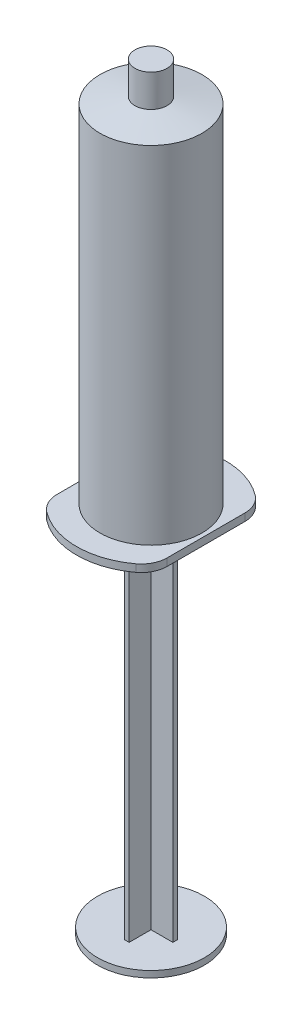
ISO-10303-21;
HEADER;
FILE_DESCRIPTION(('STEP AP214'),'2;1');
FILE_NAME('part.step','',(''),(''),'','','');
FILE_SCHEMA(('AUTOMOTIVE_DESIGN { 1 0 10303 214 1 1 1 1 }'));
ENDSEC;
DATA;
#1=APPLICATION_CONTEXT('core data for automotive mechanical design processes');
#2=APPLICATION_PROTOCOL_DEFINITION('international standard','automotive_design',2000,#1);
#3=PRODUCT_CONTEXT('',#1,'mechanical');
#4=PRODUCT('Part','Part','',(#3));
#5=PRODUCT_RELATED_PRODUCT_CATEGORY('part','',(#4));
#6=PRODUCT_DEFINITION_FORMATION('','',#4);
#7=PRODUCT_DEFINITION_CONTEXT('part definition',#1,'design');
#8=PRODUCT_DEFINITION('design','',#6,#7);
#9=PRODUCT_DEFINITION_SHAPE('','',#8);
#10=(LENGTH_UNIT() NAMED_UNIT(*) SI_UNIT(.MILLI.,.METRE.));
#11=(NAMED_UNIT(*) PLANE_ANGLE_UNIT() SI_UNIT($,.RADIAN.));
#12=(NAMED_UNIT(*) SI_UNIT($,.STERADIAN.) SOLID_ANGLE_UNIT());
#13=UNCERTAINTY_MEASURE_WITH_UNIT(LENGTH_MEASURE(1.E-05),#10,'distance_accuracy_value','');
#14=(GEOMETRIC_REPRESENTATION_CONTEXT(3) GLOBAL_UNCERTAINTY_ASSIGNED_CONTEXT((#13)) GLOBAL_UNIT_ASSIGNED_CONTEXT((#10,
#11,#12)) REPRESENTATION_CONTEXT('',''));
#15=CARTESIAN_POINT('',(0.,0.,0.));
#16=DIRECTION('',(0.,0.,1.));
#17=DIRECTION('',(1.,0.,0.));
#18=AXIS2_PLACEMENT_3D('',#15,#16,#17);
#19=CARTESIAN_POINT('',(-9.,-2.3,-12.));
#20=DIRECTION('',(0.,-1.,0.));
#21=DIRECTION('',(0.,0.,-1.));
#22=AXIS2_PLACEMENT_3D('',#19,#20,#21);
#23=PLANE('',#22);
#24=CARTESIAN_POINT('',(-9.,-2.3,-12.));
#25=DIRECTION('',(0.,-1.,0.));
#26=DIRECTION('',(0.,0.,-1.));
#27=AXIS2_PLACEMENT_3D('',#24,#25,#26);
#28=CIRCLE('',#27,8.);
#29=CARTESIAN_POINT('',(-17.,-2.3,-12.));
#30=VERTEX_POINT('',#29);
#31=CARTESIAN_POINT('',(-13.8,-2.3,-18.4));
#32=VERTEX_POINT('',#31);
#33=EDGE_CURVE('E158',#30,#32,#28,.T.);
#34=ORIENTED_EDGE('',*,*,#33,.T.);
#35=CARTESIAN_POINT('',(0.,-2.3,0.));
#36=DIRECTION('',(0.,-1.,0.));
#37=DIRECTION('',(0.,0.,-1.));
#38=AXIS2_PLACEMENT_3D('',#35,#36,#37);
#39=CIRCLE('',#38,23.);
#40=CARTESIAN_POINT('',(13.8,-2.3,-18.4));
#41=VERTEX_POINT('',#40);
#42=EDGE_CURVE('E98',#32,#41,#39,.T.);
#43=ORIENTED_EDGE('',*,*,#42,.T.);
#44=CARTESIAN_POINT('',(9.,-2.3,-12.));
#45=DIRECTION('',(0.,-1.,0.));
#46=DIRECTION('',(0.,0.,1.));
#47=AXIS2_PLACEMENT_3D('',#44,#45,#46);
#48=CIRCLE('',#47,8.);
#49=CARTESIAN_POINT('',(17.,-2.3,-12.));
#50=VERTEX_POINT('',#49);
#51=EDGE_CURVE('E575',#41,#50,#48,.T.);
#52=ORIENTED_EDGE('',*,*,#51,.T.);
#53=DIRECTION('',(0.,0.,1.));
#54=VECTOR('',#53,1.);
#55=CARTESIAN_POINT('',(17.,-2.3,12.));
#56=LINE('',#55,#54);
#57=CARTESIAN_POINT('',(17.,-2.3,12.));
#58=VERTEX_POINT('',#57);
#59=EDGE_CURVE('E577',#50,#58,#56,.T.);
#60=ORIENTED_EDGE('',*,*,#59,.T.);
#61=CARTESIAN_POINT('',(9.,-2.3,12.));
#62=DIRECTION('',(0.,-1.,0.));
#63=DIRECTION('',(0.,0.,-1.));
#64=AXIS2_PLACEMENT_3D('',#61,#62,#63);
#65=CIRCLE('',#64,8.);
#66=CARTESIAN_POINT('',(13.8,-2.3,18.4));
#67=VERTEX_POINT('',#66);
#68=EDGE_CURVE('E121',#58,#67,#65,.T.);
#69=ORIENTED_EDGE('',*,*,#68,.T.);
#70=CARTESIAN_POINT('',(0.,-2.3,0.));
#71=DIRECTION('',(0.,-1.,0.));
#72=DIRECTION('',(0.,0.,-1.));
#73=AXIS2_PLACEMENT_3D('',#70,#71,#72);
#74=CIRCLE('',#73,23.);
#75=CARTESIAN_POINT('',(-13.8,-2.3,18.4));
#76=VERTEX_POINT('',#75);
#77=EDGE_CURVE('E114',#67,#76,#74,.T.);
#78=ORIENTED_EDGE('',*,*,#77,.T.);
#79=CARTESIAN_POINT('',(-9.,-2.3,12.));
#80=DIRECTION('',(0.,-1.,0.));
#81=DIRECTION('',(0.,0.,1.));
#82=AXIS2_PLACEMENT_3D('',#79,#80,#81);
#83=CIRCLE('',#82,8.);
#84=CARTESIAN_POINT('',(-17.,-2.3,12.));
#85=VERTEX_POINT('',#84);
#86=EDGE_CURVE('E118',#76,#85,#83,.T.);
#87=ORIENTED_EDGE('',*,*,#86,.T.);
#88=DIRECTION('',(0.,0.,-1.));
#89=VECTOR('',#88,1.);
#90=CARTESIAN_POINT('',(-17.,-2.3,12.));
#91=LINE('',#90,#89);
#92=EDGE_CURVE('E56',#85,#30,#91,.T.);
#93=ORIENTED_EDGE('',*,*,#92,.T.);
#94=EDGE_LOOP('',(#34,#43,#52,#60,#69,#78,#87,#93));
#95=FACE_BOUND('',#94,.T.);
#96=DIRECTION('',(-1.,0.,0.));
#97=VECTOR('',#96,1.);
#98=CARTESIAN_POINT('',(-0.750000000000001,-2.3,7.5));
#99=LINE('',#98,#97);
#100=CARTESIAN_POINT('',(0.749999999999999,-2.3,7.5));
#101=VERTEX_POINT('',#100);
#102=CARTESIAN_POINT('',(-0.750000000000001,-2.3,7.5));
#103=VERTEX_POINT('',#102);
#104=EDGE_CURVE('E469',#101,#103,#99,.T.);
#105=ORIENTED_EDGE('',*,*,#104,.F.);
#106=DIRECTION('',(0.,0.,1.));
#107=VECTOR('',#106,1.);
#108=CARTESIAN_POINT('',(0.75,-2.3,0.750000000000002));
#109=LINE('',#108,#107);
#110=CARTESIAN_POINT('',(0.75,-2.3,0.750000000000002));
#111=VERTEX_POINT('',#110);
#112=EDGE_CURVE('E465',#111,#101,#109,.T.);
#113=ORIENTED_EDGE('',*,*,#112,.F.);
#114=DIRECTION('',(-1.,0.,0.));
#115=VECTOR('',#114,1.);
#116=CARTESIAN_POINT('',(0.75,-2.3,0.750000000000002));
#117=LINE('',#116,#115);
#118=CARTESIAN_POINT('',(7.5,-2.3,0.75));
#119=VERTEX_POINT('',#118);
#120=EDGE_CURVE('E478',#119,#111,#117,.T.);
#121=ORIENTED_EDGE('',*,*,#120,.F.);
#122=DIRECTION('',(0.,0.,1.));
#123=VECTOR('',#122,1.);
#124=CARTESIAN_POINT('',(7.5,-2.3,0.75));
#125=LINE('',#124,#123);
#126=CARTESIAN_POINT('',(7.5,-2.3,-0.75));
#127=VERTEX_POINT('',#126);
#128=EDGE_CURVE('E538',#127,#119,#125,.T.);
#129=ORIENTED_EDGE('',*,*,#128,.F.);
#130=DIRECTION('',(1.,0.,0.));
#131=VECTOR('',#130,1.);
#132=CARTESIAN_POINT('',(0.749999999999999,-2.3,-0.749999999999999));
#133=LINE('',#132,#131);
#134=CARTESIAN_POINT('',(0.749999999999999,-2.3,-0.749999999999999));
#135=VERTEX_POINT('',#134);
#136=EDGE_CURVE('E535',#135,#127,#133,.T.);
#137=ORIENTED_EDGE('',*,*,#136,.F.);
#138=DIRECTION('',(0.,0.,1.));
#139=VECTOR('',#138,1.);
#140=CARTESIAN_POINT('',(0.749999999999999,-2.3,-7.5));
#141=LINE('',#140,#139);
#142=CARTESIAN_POINT('',(0.749999999999999,-2.3,-7.5));
#143=VERTEX_POINT('',#142);
#144=EDGE_CURVE('E532',#143,#135,#141,.T.);
#145=ORIENTED_EDGE('',*,*,#144,.F.);
#146=DIRECTION('',(1.,0.,0.));
#147=VECTOR('',#146,1.);
#148=CARTESIAN_POINT('',(-0.750000000000001,-2.3,-7.5));
#149=LINE('',#148,#147);
#150=CARTESIAN_POINT('',(-0.750000000000001,-2.3,-7.5));
#151=VERTEX_POINT('',#150);
#152=EDGE_CURVE('E529',#151,#143,#149,.T.);
#153=ORIENTED_EDGE('',*,*,#152,.F.);
#154=DIRECTION('',(0.,0.,-1.));
#155=VECTOR('',#154,1.);
#156=CARTESIAN_POINT('',(-0.750000000000001,-2.3,-7.5));
#157=LINE('',#156,#155);
#158=CARTESIAN_POINT('',(-0.75,-2.3,-0.750000000000001));
#159=VERTEX_POINT('',#158);
#160=EDGE_CURVE('E526',#159,#151,#157,.T.);
#161=ORIENTED_EDGE('',*,*,#160,.F.);
#162=DIRECTION('',(1.,0.,0.));
#163=VECTOR('',#162,1.);
#164=CARTESIAN_POINT('',(-7.5,-2.3,-0.75));
#165=LINE('',#164,#163);
#166=CARTESIAN_POINT('',(-7.5,-2.3,-0.75));
#167=VERTEX_POINT('',#166);
#168=EDGE_CURVE('E523',#167,#159,#165,.T.);
#169=ORIENTED_EDGE('',*,*,#168,.F.);
#170=DIRECTION('',(0.,0.,-1.));
#171=VECTOR('',#170,1.);
#172=CARTESIAN_POINT('',(-7.5,-2.3,0.75));
#173=LINE('',#172,#171);
#174=CARTESIAN_POINT('',(-7.5,-2.3,0.75));
#175=VERTEX_POINT('',#174);
#176=EDGE_CURVE('E520',#175,#167,#173,.T.);
#177=ORIENTED_EDGE('',*,*,#176,.F.);
#178=DIRECTION('',(-1.,0.,0.));
#179=VECTOR('',#178,1.);
#180=CARTESIAN_POINT('',(-7.5,-2.3,0.75));
#181=LINE('',#180,#179);
#182=CARTESIAN_POINT('',(-0.750000000000001,-2.3,0.75));
#183=VERTEX_POINT('',#182);
#184=EDGE_CURVE('E517',#183,#175,#181,.T.);
#185=ORIENTED_EDGE('',*,*,#184,.F.);
#186=DIRECTION('',(0.,0.,-1.));
#187=VECTOR('',#186,1.);
#188=CARTESIAN_POINT('',(-0.750000000000001,-2.3,0.75));
#189=LINE('',#188,#187);
#190=EDGE_CURVE('E514',#103,#183,#189,.T.);
#191=ORIENTED_EDGE('',*,*,#190,.F.);
#192=EDGE_LOOP('',(#105,#113,#121,#129,#137,#145,#153,#161,#169,#177,#185,#191));
#193=FACE_BOUND('',#192,.T.);
#194=ADVANCED_FACE('F32',(#95,#193),#23,.T.);
#195=CARTESIAN_POINT('',(0.,109.,0.));
#196=DIRECTION('',(0.,-1.,0.));
#197=DIRECTION('',(0.,0.,-1.));
#198=AXIS2_PLACEMENT_3D('',#195,#196,#197);
#199=CYLINDRICAL_SURFACE('',#198,15.75);
#200=CARTESIAN_POINT('',(0.,107.,0.));
#201=DIRECTION('',(0.,1.,0.));
#202=DIRECTION('',(0.,0.,1.));
#203=AXIS2_PLACEMENT_3D('',#200,#201,#202);
#204=CIRCLE('',#203,15.75);
#205=CARTESIAN_POINT('',(0.,107.,-15.75));
#206=VERTEX_POINT('',#205);
#207=EDGE_CURVE('E11',#206,#206,#204,.F.);
#208=ORIENTED_EDGE('',*,*,#207,.T.);
#209=EDGE_LOOP('',(#208));
#210=FACE_BOUND('',#209,.T.);
#211=CARTESIAN_POINT('',(0.,0.,0.));
#212=DIRECTION('',(0.,-1.,0.));
#213=DIRECTION('',(0.,0.,-1.));
#214=AXIS2_PLACEMENT_3D('',#211,#212,#213);
#215=CIRCLE('',#214,15.75);
#216=CARTESIAN_POINT('',(0.,0.,-15.75));
#217=VERTEX_POINT('',#216);
#218=EDGE_CURVE('E173',#217,#217,#215,.T.);
#219=ORIENTED_EDGE('',*,*,#218,.F.);
#220=EDGE_LOOP('',(#219));
#221=FACE_BOUND('',#220,.T.);
#222=ADVANCED_FACE('F184',(#210,#221),#199,.T.);
#223=CARTESIAN_POINT('',(0.,109.,0.));
#224=DIRECTION('',(0.,-1.,0.));
#225=DIRECTION('',(0.,0.,-1.));
#226=AXIS2_PLACEMENT_3D('',#223,#224,#225);
#227=CONICAL_SURFACE('',#226,4.95896565136172,1.38753675533549);
#228=CARTESIAN_POINT('',(0.,109.,0.));
#229=DIRECTION('',(0.,1.,0.));
#230=DIRECTION('',(0.,0.,1.));
#231=AXIS2_PLACEMENT_3D('',#228,#229,#230);
#232=CIRCLE('',#231,4.95896565136172);
#233=CARTESIAN_POINT('',(0.,109.,-4.95896565136176));
#234=VERTEX_POINT('',#233);
#235=EDGE_CURVE('E40',#234,#234,#232,.T.);
#236=CARTESIAN_POINT('',(0.,107.,-15.75));
#237=CARTESIAN_POINT('',(0.,107.020833333333,-15.6375933922017));
#238=CARTESIAN_POINT('',(0.,107.041666666667,-15.5251867844034));
#239=CARTESIAN_POINT('',(0.,107.083333333333,-15.3003735688068));
#240=CARTESIAN_POINT('',(0.,107.104166666667,-15.1879669610085));
#241=CARTESIAN_POINT('',(0.,107.145833333333,-14.9631537454118));
#242=CARTESIAN_POINT('',(0.,107.166666666667,-14.8507471376135));
#243=CARTESIAN_POINT('',(0.,107.208333333333,-14.6259339220169));
#244=CARTESIAN_POINT('',(0.,107.229166666667,-14.5135273142186));
#245=CARTESIAN_POINT('',(0.,107.270833333333,-14.2887140986219));
#246=CARTESIAN_POINT('',(0.,107.291666666667,-14.1763074908236));
#247=CARTESIAN_POINT('',(0.,107.333333333333,-13.951494275227));
#248=CARTESIAN_POINT('',(0.,107.354166666667,-13.8390876674287));
#249=CARTESIAN_POINT('',(0.,107.395833333333,-13.614274451832));
#250=CARTESIAN_POINT('',(0.,107.416666666667,-13.5018678440337));
#251=CARTESIAN_POINT('',(0.,107.458333333333,-13.2770546284371));
#252=CARTESIAN_POINT('',(0.,107.479166666667,-13.1646480206388));
#253=CARTESIAN_POINT('',(0.,107.520833333333,-12.9398348050422));
#254=CARTESIAN_POINT('',(0.,107.541666666667,-12.8274281972438));
#255=CARTESIAN_POINT('',(0.,107.583333333333,-12.6026149816472));
#256=CARTESIAN_POINT('',(0.,107.604166666667,-12.4902083738489));
#257=CARTESIAN_POINT('',(0.,107.645833333333,-12.2653951582523));
#258=CARTESIAN_POINT('',(0.,107.666666666667,-12.1529885504539));
#259=CARTESIAN_POINT('',(0.,107.708333333333,-11.9281753348573));
#260=CARTESIAN_POINT('',(0.,107.729166666667,-11.815768727059));
#261=CARTESIAN_POINT('',(0.,107.770833333333,-11.5909555114624));
#262=CARTESIAN_POINT('',(0.,107.791666666667,-11.4785489036641));
#263=CARTESIAN_POINT('',(0.,107.833333333333,-11.2537356880674));
#264=CARTESIAN_POINT('',(0.,107.854166666667,-11.1413290802691));
#265=CARTESIAN_POINT('',(0.,107.895833333333,-10.9165158646725));
#266=CARTESIAN_POINT('',(0.,107.916666666667,-10.8041092568742));
#267=CARTESIAN_POINT('',(0.,107.958333333333,-10.5792960412775));
#268=CARTESIAN_POINT('',(0.,107.979166666667,-10.4668894334792));
#269=CARTESIAN_POINT('',(0.,108.020833333333,-10.2420762178826));
#270=CARTESIAN_POINT('',(0.,108.041666666667,-10.1296696100843));
#271=CARTESIAN_POINT('',(0.,108.083333333333,-9.90485639448764));
#272=CARTESIAN_POINT('',(0.,108.104166666667,-9.79244978668932));
#273=CARTESIAN_POINT('',(0.,108.145833333333,-9.56763657109269));
#274=CARTESIAN_POINT('',(0.,108.166666666667,-9.45522996329438));
#275=CARTESIAN_POINT('',(0.,108.208333333333,-9.23041674769775));
#276=CARTESIAN_POINT('',(0.,108.229166666667,-9.11801013989943));
#277=CARTESIAN_POINT('',(0.,108.270833333333,-8.8931969243028));
#278=CARTESIAN_POINT('',(0.,108.291666666667,-8.78079031650448));
#279=CARTESIAN_POINT('',(0.,108.333333333333,-8.55597710090785));
#280=CARTESIAN_POINT('',(0.,108.354166666667,-8.44357049310954));
#281=CARTESIAN_POINT('',(0.,108.395833333333,-8.21875727751291));
#282=CARTESIAN_POINT('',(0.,108.416666666667,-8.10635066971459));
#283=CARTESIAN_POINT('',(0.,108.458333333333,-7.88153745411796));
#284=CARTESIAN_POINT('',(0.,108.479166666667,-7.76913084631965));
#285=CARTESIAN_POINT('',(0.,108.520833333333,-7.54431763072301));
#286=CARTESIAN_POINT('',(0.,108.541666666667,-7.4319110229247));
#287=CARTESIAN_POINT('',(0.,108.583333333333,-7.20709780732807));
#288=CARTESIAN_POINT('',(0.,108.604166666667,-7.09469119952975));
#289=CARTESIAN_POINT('',(0.,108.645833333333,-6.86987798393312));
#290=CARTESIAN_POINT('',(0.,108.666666666667,-6.75747137613481));
#291=CARTESIAN_POINT('',(0.,108.708333333333,-6.53265816053818));
#292=CARTESIAN_POINT('',(0.,108.729166666667,-6.42025155273986));
#293=CARTESIAN_POINT('',(0.,108.770833333333,-6.19543833714323));
#294=CARTESIAN_POINT('',(0.,108.791666666667,-6.08303172934492));
#295=CARTESIAN_POINT('',(0.,108.833333333333,-5.85821851374829));
#296=CARTESIAN_POINT('',(0.,108.854166666667,-5.74581190594997));
#297=CARTESIAN_POINT('',(0.,108.895833333333,-5.52099869035334));
#298=CARTESIAN_POINT('',(0.,108.916666666667,-5.40859208255502));
#299=CARTESIAN_POINT('',(0.,108.958333333333,-5.18377886695839));
#300=CARTESIAN_POINT('',(0.,108.979166666667,-5.07137225916008));
#301=CARTESIAN_POINT('',(0.,109.,-4.95896565136176));
#302=B_SPLINE_CURVE_WITH_KNOTS('',3,(#236,#237,#238,#239,#240,#241,#242,#243,#244,#245,#246,
#247,#248,#249,#250,#251,#252,#253,#254,#255,#256,#257,#258,#259,#260,#261,#262,#263,#264,#265,
#266,#267,#268,#269,#270,#271,#272,#273,#274,#275,#276,#277,#278,#279,#280,#281,#282,#283,#284,
#285,#286,#287,#288,#289,#290,#291,#292,#293,#294,#295,#296,#297,#298,#299,#300,#301),
.UNSPECIFIED.,.F.,.F.,(4,2,2,2,2,2,2,2,2,2,2,2,2,2,2,2,2,2,2,2,2,2,2,2,2,2,2,2,2,2,2,2,4),(0.,
0.342962766624193,0.685925533248383,1.02888829987257,1.37185106649676,1.71481383312095,
2.05777659974514,2.40073936636933,2.74370213299352,3.08666489961771,3.4296276662419,
3.77259043286609,4.11555319949028,4.45851596611447,4.80147873273866,5.14444149936285,
5.48740426598704,5.83036703261123,6.17332979923542,6.51629256585961,6.8592553324838,
7.20221809910799,7.54518086573218,7.88814363235637,8.23110639898056,8.57406916560475,
8.91703193222895,9.25999469885313,9.60295746547732,9.94592023210152,10.2888829987257,
10.6318457653499,10.9748085319741),.UNSPECIFIED.);
#303=EDGE_CURVE('BSEAM34',#206,#234,#302,.T.);
#304=ORIENTED_EDGE('',*,*,#207,.F.);
#305=ORIENTED_EDGE('',*,*,#235,.F.);
#306=ORIENTED_EDGE('',*,*,#303,.T.);
#307=ORIENTED_EDGE('',*,*,#303,.F.);
#308=EDGE_LOOP('',(#304,#306,#305,#307));
#309=FACE_BOUND('',#308,.T.);
#310=ADVANCED_FACE('F34',(#309),#227,.T.);
#311=CARTESIAN_POINT('',(0.,119.,0.));
#312=DIRECTION('',(0.,-1.,0.));
#313=DIRECTION('',(0.,0.,-1.));
#314=AXIS2_PLACEMENT_3D('',#311,#312,#313);
#315=CYLINDRICAL_SURFACE('',#314,4.95896565136172);
#316=CARTESIAN_POINT('',(0.,119.,0.));
#317=DIRECTION('',(0.,1.,0.));
#318=DIRECTION('',(0.,0.,1.));
#319=AXIS2_PLACEMENT_3D('',#316,#317,#318);
#320=CIRCLE('',#319,4.95896565136172);
#321=CARTESIAN_POINT('',(0.,119.,4.95896565136172));
#322=VERTEX_POINT('',#321);
#323=EDGE_CURVE('E176',#322,#322,#320,.T.);
#324=ORIENTED_EDGE('',*,*,#323,.F.);
#325=EDGE_LOOP('',(#324));
#326=FACE_BOUND('',#325,.T.);
#327=ORIENTED_EDGE('',*,*,#235,.T.);
#328=EDGE_LOOP('',(#327));
#329=FACE_BOUND('',#328,.T.);
#330=ADVANCED_FACE('F181',(#326,#329),#315,.T.);
#331=CARTESIAN_POINT('',(0.,119.,0.));
#332=DIRECTION('',(0.,1.,0.));
#333=DIRECTION('',(0.,0.,1.));
#334=AXIS2_PLACEMENT_3D('',#331,#332,#333);
#335=PLANE('',#334);
#336=ORIENTED_EDGE('',*,*,#323,.T.);
#337=EDGE_LOOP('',(#336));
#338=FACE_BOUND('',#337,.T.);
#339=ADVANCED_FACE('F190',(#338),#335,.T.);
#340=CARTESIAN_POINT('',(-9.,-2.3,-12.));
#341=DIRECTION('',(0.,1.,0.));
#342=DIRECTION('',(0.,0.,1.));
#343=AXIS2_PLACEMENT_3D('',#340,#341,#342);
#344=CYLINDRICAL_SURFACE('',#343,8.);
#345=CARTESIAN_POINT('',(-9.,0.,-12.));
#346=DIRECTION('',(0.,-1.,0.));
#347=DIRECTION('',(0.,0.,-1.));
#348=AXIS2_PLACEMENT_3D('',#345,#346,#347);
#349=CIRCLE('',#348,8.);
#350=CARTESIAN_POINT('',(-17.,0.,-12.));
#351=VERTEX_POINT('',#350);
#352=CARTESIAN_POINT('',(-13.8,0.,-18.4));
#353=VERTEX_POINT('',#352);
#354=EDGE_CURVE('E142',#351,#353,#349,.T.);
#355=ORIENTED_EDGE('',*,*,#354,.T.);
#356=DIRECTION('',(0.,1.,0.));
#357=VECTOR('',#356,1.);
#358=CARTESIAN_POINT('',(-13.8,-2.3,-18.4));
#359=LINE('',#358,#357);
#360=EDGE_CURVE('E171',#32,#353,#359,.T.);
#361=ORIENTED_EDGE('',*,*,#360,.F.);
#362=ORIENTED_EDGE('',*,*,#33,.F.);
#363=DIRECTION('',(0.,1.,0.));
#364=VECTOR('',#363,1.);
#365=CARTESIAN_POINT('',(-17.,-2.3,-12.));
#366=LINE('',#365,#364);
#367=EDGE_CURVE('E138',#30,#351,#366,.T.);
#368=ORIENTED_EDGE('',*,*,#367,.T.);
#369=EDGE_LOOP('',(#355,#361,#362,#368));
#370=FACE_BOUND('',#369,.T.);
#371=ADVANCED_FACE('F229',(#370),#344,.T.);
#372=CARTESIAN_POINT('',(0.,-2.3,0.));
#373=DIRECTION('',(0.,1.,0.));
#374=DIRECTION('',(0.,0.,1.));
#375=AXIS2_PLACEMENT_3D('',#372,#373,#374);
#376=CYLINDRICAL_SURFACE('',#375,23.);
#377=CARTESIAN_POINT('',(0.,0.,0.));
#378=DIRECTION('',(0.,-1.,0.));
#379=DIRECTION('',(0.,0.,-1.));
#380=AXIS2_PLACEMENT_3D('',#377,#378,#379);
#381=CIRCLE('',#380,23.);
#382=CARTESIAN_POINT('',(13.8,0.,-18.4));
#383=VERTEX_POINT('',#382);
#384=EDGE_CURVE('E145',#353,#383,#381,.T.);
#385=ORIENTED_EDGE('',*,*,#384,.T.);
#386=DIRECTION('',(0.,1.,0.));
#387=VECTOR('',#386,1.);
#388=CARTESIAN_POINT('',(13.8,-2.3,-18.4));
#389=LINE('',#388,#387);
#390=EDGE_CURVE('E168',#41,#383,#389,.T.);
#391=ORIENTED_EDGE('',*,*,#390,.F.);
#392=ORIENTED_EDGE('',*,*,#42,.F.);
#393=ORIENTED_EDGE('',*,*,#360,.T.);
#394=EDGE_LOOP('',(#385,#391,#392,#393));
#395=FACE_BOUND('',#394,.T.);
#396=ADVANCED_FACE('F225',(#395),#376,.T.);
#397=CARTESIAN_POINT('',(9.,-2.3,-12.));
#398=DIRECTION('',(0.,1.,0.));
#399=DIRECTION('',(0.,0.,1.));
#400=AXIS2_PLACEMENT_3D('',#397,#398,#399);
#401=CYLINDRICAL_SURFACE('',#400,8.);
#402=CARTESIAN_POINT('',(9.,0.,-12.));
#403=DIRECTION('',(0.,-1.,0.));
#404=DIRECTION('',(0.,0.,1.));
#405=AXIS2_PLACEMENT_3D('',#402,#403,#404);
#406=CIRCLE('',#405,8.);
#407=CARTESIAN_POINT('',(17.,0.,-12.));
#408=VERTEX_POINT('',#407);
#409=EDGE_CURVE('E148',#383,#408,#406,.T.);
#410=ORIENTED_EDGE('',*,*,#409,.T.);
#411=DIRECTION('',(0.,1.,0.));
#412=VECTOR('',#411,1.);
#413=CARTESIAN_POINT('',(17.,-2.3,-12.));
#414=LINE('',#413,#412);
#415=EDGE_CURVE('E165',#50,#408,#414,.T.);
#416=ORIENTED_EDGE('',*,*,#415,.F.);
#417=ORIENTED_EDGE('',*,*,#51,.F.);
#418=ORIENTED_EDGE('',*,*,#390,.T.);
#419=EDGE_LOOP('',(#410,#416,#417,#418));
#420=FACE_BOUND('',#419,.T.);
#421=ADVANCED_FACE('F221',(#420),#401,.T.);
#422=CARTESIAN_POINT('',(17.,-2.3,12.));
#423=DIRECTION('',(-1.,0.,0.));
#424=DIRECTION('',(0.,0.,1.));
#425=AXIS2_PLACEMENT_3D('',#422,#423,#424);
#426=PLANE('',#425);
#427=DIRECTION('',(0.,0.,1.));
#428=VECTOR('',#427,1.);
#429=CARTESIAN_POINT('',(17.,0.,12.));
#430=LINE('',#429,#428);
#431=CARTESIAN_POINT('',(17.,0.,12.));
#432=VERTEX_POINT('',#431);
#433=EDGE_CURVE('E150',#408,#432,#430,.T.);
#434=ORIENTED_EDGE('',*,*,#433,.T.);
#435=DIRECTION('',(0.,1.,0.));
#436=VECTOR('',#435,1.);
#437=CARTESIAN_POINT('',(17.,-2.3,12.));
#438=LINE('',#437,#436);
#439=EDGE_CURVE('E162',#58,#432,#438,.T.);
#440=ORIENTED_EDGE('',*,*,#439,.F.);
#441=ORIENTED_EDGE('',*,*,#59,.F.);
#442=ORIENTED_EDGE('',*,*,#415,.T.);
#443=EDGE_LOOP('',(#434,#440,#441,#442));
#444=FACE_BOUND('',#443,.T.);
#445=ADVANCED_FACE('F217',(#444),#426,.F.);
#446=CARTESIAN_POINT('',(9.,-2.3,12.));
#447=DIRECTION('',(0.,1.,0.));
#448=DIRECTION('',(0.,0.,1.));
#449=AXIS2_PLACEMENT_3D('',#446,#447,#448);
#450=CYLINDRICAL_SURFACE('',#449,8.);
#451=CARTESIAN_POINT('',(9.,0.,12.));
#452=DIRECTION('',(0.,-1.,0.));
#453=DIRECTION('',(0.,0.,-1.));
#454=AXIS2_PLACEMENT_3D('',#451,#452,#453);
#455=CIRCLE('',#454,8.);
#456=CARTESIAN_POINT('',(13.8,0.,18.4));
#457=VERTEX_POINT('',#456);
#458=EDGE_CURVE('E152',#432,#457,#455,.T.);
#459=ORIENTED_EDGE('',*,*,#458,.T.);
#460=DIRECTION('',(0.,1.,0.));
#461=VECTOR('',#460,1.);
#462=CARTESIAN_POINT('',(13.8,-2.3,18.4));
#463=LINE('',#462,#461);
#464=EDGE_CURVE('E133',#67,#457,#463,.T.);
#465=ORIENTED_EDGE('',*,*,#464,.F.);
#466=ORIENTED_EDGE('',*,*,#68,.F.);
#467=ORIENTED_EDGE('',*,*,#439,.T.);
#468=EDGE_LOOP('',(#459,#465,#466,#467));
#469=FACE_BOUND('',#468,.T.);
#470=ADVANCED_FACE('F214',(#469),#450,.T.);
#471=CARTESIAN_POINT('',(0.,-2.3,0.));
#472=DIRECTION('',(0.,1.,0.));
#473=DIRECTION('',(0.,0.,1.));
#474=AXIS2_PLACEMENT_3D('',#471,#472,#473);
#475=CYLINDRICAL_SURFACE('',#474,23.);
#476=CARTESIAN_POINT('',(0.,0.,0.));
#477=DIRECTION('',(0.,-1.,0.));
#478=DIRECTION('',(0.,0.,-1.));
#479=AXIS2_PLACEMENT_3D('',#476,#477,#478);
#480=CIRCLE('',#479,23.);
#481=CARTESIAN_POINT('',(-13.8,0.,18.4));
#482=VERTEX_POINT('',#481);
#483=EDGE_CURVE('E130',#457,#482,#480,.T.);
#484=ORIENTED_EDGE('',*,*,#483,.T.);
#485=DIRECTION('',(0.,1.,0.));
#486=VECTOR('',#485,1.);
#487=CARTESIAN_POINT('',(-13.8,-2.3,18.4));
#488=LINE('',#487,#486);
#489=EDGE_CURVE('E127',#76,#482,#488,.T.);
#490=ORIENTED_EDGE('',*,*,#489,.F.);
#491=ORIENTED_EDGE('',*,*,#77,.F.);
#492=ORIENTED_EDGE('',*,*,#464,.T.);
#493=EDGE_LOOP('',(#484,#490,#491,#492));
#494=FACE_BOUND('',#493,.T.);
#495=ADVANCED_FACE('F128',(#494),#475,.T.);
#496=CARTESIAN_POINT('',(-9.,-2.3,12.));
#497=DIRECTION('',(0.,1.,0.));
#498=DIRECTION('',(0.,0.,1.));
#499=AXIS2_PLACEMENT_3D('',#496,#497,#498);
#500=CYLINDRICAL_SURFACE('',#499,8.);
#501=CARTESIAN_POINT('',(-9.,0.,12.));
#502=DIRECTION('',(0.,-1.,0.));
#503=DIRECTION('',(0.,0.,1.));
#504=AXIS2_PLACEMENT_3D('',#501,#502,#503);
#505=CIRCLE('',#504,8.);
#506=CARTESIAN_POINT('',(-17.,0.,12.));
#507=VERTEX_POINT('',#506);
#508=EDGE_CURVE('E155',#482,#507,#505,.T.);
#509=ORIENTED_EDGE('',*,*,#508,.T.);
#510=DIRECTION('',(0.,1.,0.));
#511=VECTOR('',#510,1.);
#512=CARTESIAN_POINT('',(-17.,-2.3,12.));
#513=LINE('',#512,#511);
#514=EDGE_CURVE('E134',#85,#507,#513,.T.);
#515=ORIENTED_EDGE('',*,*,#514,.F.);
#516=ORIENTED_EDGE('',*,*,#86,.F.);
#517=ORIENTED_EDGE('',*,*,#489,.T.);
#518=EDGE_LOOP('',(#509,#515,#516,#517));
#519=FACE_BOUND('',#518,.T.);
#520=ADVANCED_FACE('F136',(#519),#500,.T.);
#521=CARTESIAN_POINT('',(-17.,-2.3,12.));
#522=DIRECTION('',(1.,0.,0.));
#523=DIRECTION('',(0.,0.,-1.));
#524=AXIS2_PLACEMENT_3D('',#521,#522,#523);
#525=PLANE('',#524);
#526=DIRECTION('',(0.,0.,-1.));
#527=VECTOR('',#526,1.);
#528=CARTESIAN_POINT('',(-17.,0.,12.));
#529=LINE('',#528,#527);
#530=EDGE_CURVE('E89',#507,#351,#529,.T.);
#531=ORIENTED_EDGE('',*,*,#530,.T.);
#532=ORIENTED_EDGE('',*,*,#367,.F.);
#533=ORIENTED_EDGE('',*,*,#92,.F.);
#534=ORIENTED_EDGE('',*,*,#514,.T.);
#535=EDGE_LOOP('',(#531,#532,#533,#534));
#536=FACE_BOUND('',#535,.T.);
#537=ADVANCED_FACE('F206',(#536),#525,.F.);
#538=CARTESIAN_POINT('',(-9.,0.,-12.));
#539=DIRECTION('',(0.,-1.,0.));
#540=DIRECTION('',(0.,0.,-1.));
#541=AXIS2_PLACEMENT_3D('',#538,#539,#540);
#542=PLANE('',#541);
#543=ORIENTED_EDGE('',*,*,#218,.T.);
#544=EDGE_LOOP('',(#543));
#545=FACE_BOUND('',#544,.T.);
#546=ORIENTED_EDGE('',*,*,#354,.F.);
#547=ORIENTED_EDGE('',*,*,#530,.F.);
#548=ORIENTED_EDGE('',*,*,#508,.F.);
#549=ORIENTED_EDGE('',*,*,#483,.F.);
#550=ORIENTED_EDGE('',*,*,#458,.F.);
#551=ORIENTED_EDGE('',*,*,#433,.F.);
#552=ORIENTED_EDGE('',*,*,#409,.F.);
#553=ORIENTED_EDGE('',*,*,#384,.F.);
#554=EDGE_LOOP('',(#546,#547,#548,#549,#550,#551,#552,#553));
#555=FACE_BOUND('',#554,.T.);
#556=ADVANCED_FACE('F203',(#545,#555),#542,.F.);
#557=CARTESIAN_POINT('',(0.75,-113.3,0.750000000000002));
#558=DIRECTION('',(-1.,0.,0.));
#559=DIRECTION('',(0.,0.,1.));
#560=AXIS2_PLACEMENT_3D('',#557,#558,#559);
#561=PLANE('',#560);
#562=ORIENTED_EDGE('',*,*,#112,.T.);
#563=DIRECTION('',(0.,1.,0.));
#564=VECTOR('',#563,1.);
#565=CARTESIAN_POINT('',(0.749999999999999,-113.3,7.5));
#566=LINE('',#565,#564);
#567=CARTESIAN_POINT('',(0.749999999999999,-113.3,7.5));
#568=VERTEX_POINT('',#567);
#569=EDGE_CURVE('E146',#568,#101,#566,.T.);
#570=ORIENTED_EDGE('',*,*,#569,.F.);
#571=DIRECTION('',(0.,0.,1.));
#572=VECTOR('',#571,1.);
#573=CARTESIAN_POINT('',(0.75,-113.3,0.750000000000002));
#574=LINE('',#573,#572);
#575=CARTESIAN_POINT('',(0.75,-113.3,0.750000000000002));
#576=VERTEX_POINT('',#575);
#577=EDGE_CURVE('E474',#576,#568,#574,.T.);
#578=ORIENTED_EDGE('',*,*,#577,.F.);
#579=DIRECTION('',(0.,1.,0.));
#580=VECTOR('',#579,1.);
#581=CARTESIAN_POINT('',(0.75,-113.3,0.750000000000002));
#582=LINE('',#581,#580);
#583=EDGE_CURVE('E510',#576,#111,#582,.T.);
#584=ORIENTED_EDGE('',*,*,#583,.T.);
#585=EDGE_LOOP('',(#562,#570,#578,#584));
#586=FACE_BOUND('',#585,.T.);
#587=ADVANCED_FACE('F201',(#586),#561,.F.);
#588=CARTESIAN_POINT('',(-0.750000000000001,-113.3,7.5));
#589=DIRECTION('',(0.,0.,-1.));
#590=DIRECTION('',(-1.,0.,0.));
#591=AXIS2_PLACEMENT_3D('',#588,#589,#590);
#592=PLANE('',#591);
#593=ORIENTED_EDGE('',*,*,#104,.T.);
#594=DIRECTION('',(0.,1.,0.));
#595=VECTOR('',#594,1.);
#596=CARTESIAN_POINT('',(-0.750000000000001,-113.3,7.5));
#597=LINE('',#596,#595);
#598=CARTESIAN_POINT('',(-0.750000000000001,-113.3,7.5));
#599=VERTEX_POINT('',#598);
#600=EDGE_CURVE('E568',#599,#103,#597,.T.);
#601=ORIENTED_EDGE('',*,*,#600,.F.);
#602=DIRECTION('',(-1.,0.,0.));
#603=VECTOR('',#602,1.);
#604=CARTESIAN_POINT('',(-0.750000000000001,-113.3,7.5));
#605=LINE('',#604,#603);
#606=EDGE_CURVE('E477',#568,#599,#605,.T.);
#607=ORIENTED_EDGE('',*,*,#606,.F.);
#608=ORIENTED_EDGE('',*,*,#569,.T.);
#609=EDGE_LOOP('',(#593,#601,#607,#608));
#610=FACE_BOUND('',#609,.T.);
#611=ADVANCED_FACE('F282',(#610),#592,.F.);
#612=CARTESIAN_POINT('',(-0.750000000000001,-113.3,0.75));
#613=DIRECTION('',(1.,0.,0.));
#614=DIRECTION('',(0.,0.,-1.));
#615=AXIS2_PLACEMENT_3D('',#612,#613,#614);
#616=PLANE('',#615);
#617=ORIENTED_EDGE('',*,*,#190,.T.);
#618=DIRECTION('',(0.,1.,0.));
#619=VECTOR('',#618,1.);
#620=CARTESIAN_POINT('',(-0.750000000000001,-113.3,0.75));
#621=LINE('',#620,#619);
#622=CARTESIAN_POINT('',(-0.750000000000001,-113.3,0.75));
#623=VERTEX_POINT('',#622);
#624=EDGE_CURVE('E565',#623,#183,#621,.T.);
#625=ORIENTED_EDGE('',*,*,#624,.F.);
#626=DIRECTION('',(0.,0.,-1.));
#627=VECTOR('',#626,1.);
#628=CARTESIAN_POINT('',(-0.750000000000001,-113.3,0.75));
#629=LINE('',#628,#627);
#630=EDGE_CURVE('E481',#599,#623,#629,.T.);
#631=ORIENTED_EDGE('',*,*,#630,.F.);
#632=ORIENTED_EDGE('',*,*,#600,.T.);
#633=EDGE_LOOP('',(#617,#625,#631,#632));
#634=FACE_BOUND('',#633,.T.);
#635=ADVANCED_FACE('F289',(#634),#616,.F.);
#636=CARTESIAN_POINT('',(-7.5,-113.3,0.75));
#637=DIRECTION('',(0.,0.,-1.));
#638=DIRECTION('',(-1.,0.,0.));
#639=AXIS2_PLACEMENT_3D('',#636,#637,#638);
#640=PLANE('',#639);
#641=ORIENTED_EDGE('',*,*,#184,.T.);
#642=DIRECTION('',(0.,1.,0.));
#643=VECTOR('',#642,1.);
#644=CARTESIAN_POINT('',(-7.5,-113.3,0.75));
#645=LINE('',#644,#643);
#646=CARTESIAN_POINT('',(-7.5,-113.3,0.75));
#647=VERTEX_POINT('',#646);
#648=EDGE_CURVE('E562',#647,#175,#645,.T.);
#649=ORIENTED_EDGE('',*,*,#648,.F.);
#650=DIRECTION('',(-1.,0.,0.));
#651=VECTOR('',#650,1.);
#652=CARTESIAN_POINT('',(-7.5,-113.3,0.75));
#653=LINE('',#652,#651);
#654=EDGE_CURVE('E484',#623,#647,#653,.T.);
#655=ORIENTED_EDGE('',*,*,#654,.F.);
#656=ORIENTED_EDGE('',*,*,#624,.T.);
#657=EDGE_LOOP('',(#641,#649,#655,#656));
#658=FACE_BOUND('',#657,.T.);
#659=ADVANCED_FACE('F296',(#658),#640,.F.);
#660=CARTESIAN_POINT('',(-7.5,-113.3,0.75));
#661=DIRECTION('',(1.,0.,0.));
#662=DIRECTION('',(0.,0.,-1.));
#663=AXIS2_PLACEMENT_3D('',#660,#661,#662);
#664=PLANE('',#663);
#665=ORIENTED_EDGE('',*,*,#176,.T.);
#666=DIRECTION('',(0.,1.,0.));
#667=VECTOR('',#666,1.);
#668=CARTESIAN_POINT('',(-7.5,-113.3,-0.75));
#669=LINE('',#668,#667);
#670=CARTESIAN_POINT('',(-7.5,-113.3,-0.75));
#671=VERTEX_POINT('',#670);
#672=EDGE_CURVE('E559',#671,#167,#669,.T.);
#673=ORIENTED_EDGE('',*,*,#672,.F.);
#674=DIRECTION('',(0.,0.,-1.));
#675=VECTOR('',#674,1.);
#676=CARTESIAN_POINT('',(-7.5,-113.3,0.75));
#677=LINE('',#676,#675);
#678=EDGE_CURVE('E487',#647,#671,#677,.T.);
#679=ORIENTED_EDGE('',*,*,#678,.F.);
#680=ORIENTED_EDGE('',*,*,#648,.T.);
#681=EDGE_LOOP('',(#665,#673,#679,#680));
#682=FACE_BOUND('',#681,.T.);
#683=ADVANCED_FACE('F304',(#682),#664,.F.);
#684=CARTESIAN_POINT('',(-7.5,-113.3,-0.75));
#685=DIRECTION('',(0.,0.,1.));
#686=DIRECTION('',(1.,0.,0.));
#687=AXIS2_PLACEMENT_3D('',#684,#685,#686);
#688=PLANE('',#687);
#689=ORIENTED_EDGE('',*,*,#168,.T.);
#690=DIRECTION('',(0.,1.,0.));
#691=VECTOR('',#690,1.);
#692=CARTESIAN_POINT('',(-0.75,-113.3,-0.750000000000001));
#693=LINE('',#692,#691);
#694=CARTESIAN_POINT('',(-0.75,-113.3,-0.750000000000001));
#695=VERTEX_POINT('',#694);
#696=EDGE_CURVE('E556',#695,#159,#693,.T.);
#697=ORIENTED_EDGE('',*,*,#696,.F.);
#698=DIRECTION('',(1.,0.,0.));
#699=VECTOR('',#698,1.);
#700=CARTESIAN_POINT('',(-7.5,-113.3,-0.75));
#701=LINE('',#700,#699);
#702=EDGE_CURVE('E490',#671,#695,#701,.T.);
#703=ORIENTED_EDGE('',*,*,#702,.F.);
#704=ORIENTED_EDGE('',*,*,#672,.T.);
#705=EDGE_LOOP('',(#689,#697,#703,#704));
#706=FACE_BOUND('',#705,.T.);
#707=ADVANCED_FACE('F312',(#706),#688,.F.);
#708=CARTESIAN_POINT('',(-0.750000000000001,-113.3,-7.5));
#709=DIRECTION('',(1.,0.,0.));
#710=DIRECTION('',(0.,0.,-1.));
#711=AXIS2_PLACEMENT_3D('',#708,#709,#710);
#712=PLANE('',#711);
#713=ORIENTED_EDGE('',*,*,#160,.T.);
#714=DIRECTION('',(0.,1.,0.));
#715=VECTOR('',#714,1.);
#716=CARTESIAN_POINT('',(-0.750000000000001,-113.3,-7.5));
#717=LINE('',#716,#715);
#718=CARTESIAN_POINT('',(-0.750000000000001,-113.3,-7.5));
#719=VERTEX_POINT('',#718);
#720=EDGE_CURVE('E553',#719,#151,#717,.T.);
#721=ORIENTED_EDGE('',*,*,#720,.F.);
#722=DIRECTION('',(0.,0.,-1.));
#723=VECTOR('',#722,1.);
#724=CARTESIAN_POINT('',(-0.750000000000001,-113.3,-7.5));
#725=LINE('',#724,#723);
#726=EDGE_CURVE('E493',#695,#719,#725,.T.);
#727=ORIENTED_EDGE('',*,*,#726,.F.);
#728=ORIENTED_EDGE('',*,*,#696,.T.);
#729=EDGE_LOOP('',(#713,#721,#727,#728));
#730=FACE_BOUND('',#729,.T.);
#731=ADVANCED_FACE('F320',(#730),#712,.F.);
#732=CARTESIAN_POINT('',(-0.750000000000001,-113.3,-7.5));
#733=DIRECTION('',(0.,0.,1.));
#734=DIRECTION('',(1.,0.,0.));
#735=AXIS2_PLACEMENT_3D('',#732,#733,#734);
#736=PLANE('',#735);
#737=ORIENTED_EDGE('',*,*,#152,.T.);
#738=DIRECTION('',(0.,1.,0.));
#739=VECTOR('',#738,1.);
#740=CARTESIAN_POINT('',(0.749999999999999,-113.3,-7.5));
#741=LINE('',#740,#739);
#742=CARTESIAN_POINT('',(0.749999999999999,-113.3,-7.5));
#743=VERTEX_POINT('',#742);
#744=EDGE_CURVE('E550',#743,#143,#741,.T.);
#745=ORIENTED_EDGE('',*,*,#744,.F.);
#746=DIRECTION('',(1.,0.,0.));
#747=VECTOR('',#746,1.);
#748=CARTESIAN_POINT('',(-0.750000000000001,-113.3,-7.5));
#749=LINE('',#748,#747);
#750=EDGE_CURVE('E496',#719,#743,#749,.T.);
#751=ORIENTED_EDGE('',*,*,#750,.F.);
#752=ORIENTED_EDGE('',*,*,#720,.T.);
#753=EDGE_LOOP('',(#737,#745,#751,#752));
#754=FACE_BOUND('',#753,.T.);
#755=ADVANCED_FACE('F328',(#754),#736,.F.);
#756=CARTESIAN_POINT('',(0.749999999999999,-113.3,-7.5));
#757=DIRECTION('',(-1.,0.,0.));
#758=DIRECTION('',(0.,0.,1.));
#759=AXIS2_PLACEMENT_3D('',#756,#757,#758);
#760=PLANE('',#759);
#761=ORIENTED_EDGE('',*,*,#144,.T.);
#762=DIRECTION('',(0.,1.,0.));
#763=VECTOR('',#762,1.);
#764=CARTESIAN_POINT('',(0.749999999999999,-113.3,-0.749999999999999));
#765=LINE('',#764,#763);
#766=CARTESIAN_POINT('',(0.749999999999999,-113.3,-0.749999999999999));
#767=VERTEX_POINT('',#766);
#768=EDGE_CURVE('E547',#767,#135,#765,.T.);
#769=ORIENTED_EDGE('',*,*,#768,.F.);
#770=DIRECTION('',(0.,0.,1.));
#771=VECTOR('',#770,1.);
#772=CARTESIAN_POINT('',(0.749999999999999,-113.3,-7.5));
#773=LINE('',#772,#771);
#774=EDGE_CURVE('E499',#743,#767,#773,.T.);
#775=ORIENTED_EDGE('',*,*,#774,.F.);
#776=ORIENTED_EDGE('',*,*,#744,.T.);
#777=EDGE_LOOP('',(#761,#769,#775,#776));
#778=FACE_BOUND('',#777,.T.);
#779=ADVANCED_FACE('F336',(#778),#760,.F.);
#780=CARTESIAN_POINT('',(0.749999999999999,-113.3,-0.749999999999999));
#781=DIRECTION('',(0.,0.,1.));
#782=DIRECTION('',(1.,0.,0.));
#783=AXIS2_PLACEMENT_3D('',#780,#781,#782);
#784=PLANE('',#783);
#785=ORIENTED_EDGE('',*,*,#136,.T.);
#786=DIRECTION('',(0.,1.,0.));
#787=VECTOR('',#786,1.);
#788=CARTESIAN_POINT('',(7.5,-113.3,-0.75));
#789=LINE('',#788,#787);
#790=CARTESIAN_POINT('',(7.5,-113.3,-0.75));
#791=VERTEX_POINT('',#790);
#792=EDGE_CURVE('E544',#791,#127,#789,.T.);
#793=ORIENTED_EDGE('',*,*,#792,.F.);
#794=DIRECTION('',(1.,0.,0.));
#795=VECTOR('',#794,1.);
#796=CARTESIAN_POINT('',(0.749999999999999,-113.3,-0.749999999999999));
#797=LINE('',#796,#795);
#798=EDGE_CURVE('E502',#767,#791,#797,.T.);
#799=ORIENTED_EDGE('',*,*,#798,.F.);
#800=ORIENTED_EDGE('',*,*,#768,.T.);
#801=EDGE_LOOP('',(#785,#793,#799,#800));
#802=FACE_BOUND('',#801,.T.);
#803=ADVANCED_FACE('F344',(#802),#784,.F.);
#804=CARTESIAN_POINT('',(7.5,-113.3,0.75));
#805=DIRECTION('',(-1.,0.,0.));
#806=DIRECTION('',(0.,0.,1.));
#807=AXIS2_PLACEMENT_3D('',#804,#805,#806);
#808=PLANE('',#807);
#809=ORIENTED_EDGE('',*,*,#128,.T.);
#810=DIRECTION('',(0.,1.,0.));
#811=VECTOR('',#810,1.);
#812=CARTESIAN_POINT('',(7.5,-113.3,0.75));
#813=LINE('',#812,#811);
#814=CARTESIAN_POINT('',(7.5,-113.3,0.75));
#815=VERTEX_POINT('',#814);
#816=EDGE_CURVE('E47',#815,#119,#813,.T.);
#817=ORIENTED_EDGE('',*,*,#816,.F.);
#818=DIRECTION('',(0.,0.,1.));
#819=VECTOR('',#818,1.);
#820=CARTESIAN_POINT('',(7.5,-113.3,0.75));
#821=LINE('',#820,#819);
#822=EDGE_CURVE('E505',#791,#815,#821,.T.);
#823=ORIENTED_EDGE('',*,*,#822,.F.);
#824=ORIENTED_EDGE('',*,*,#792,.T.);
#825=EDGE_LOOP('',(#809,#817,#823,#824));
#826=FACE_BOUND('',#825,.T.);
#827=ADVANCED_FACE('F352',(#826),#808,.F.);
#828=CARTESIAN_POINT('',(0.75,-113.3,0.750000000000002));
#829=DIRECTION('',(0.,0.,-1.));
#830=DIRECTION('',(-1.,0.,0.));
#831=AXIS2_PLACEMENT_3D('',#828,#829,#830);
#832=PLANE('',#831);
#833=ORIENTED_EDGE('',*,*,#120,.T.);
#834=ORIENTED_EDGE('',*,*,#583,.F.);
#835=DIRECTION('',(-1.,0.,0.));
#836=VECTOR('',#835,1.);
#837=CARTESIAN_POINT('',(0.75,-113.3,0.750000000000002));
#838=LINE('',#837,#836);
#839=EDGE_CURVE('E508',#815,#576,#838,.T.);
#840=ORIENTED_EDGE('',*,*,#839,.F.);
#841=ORIENTED_EDGE('',*,*,#816,.T.);
#842=EDGE_LOOP('',(#833,#834,#840,#841));
#843=FACE_BOUND('',#842,.T.);
#844=ADVANCED_FACE('F360',(#843),#832,.F.);
#845=CARTESIAN_POINT('',(0.,-113.3,0.));
#846=DIRECTION('',(0.,-1.,0.));
#847=DIRECTION('',(0.,0.,-1.));
#848=AXIS2_PLACEMENT_3D('',#845,#846,#847);
#849=PLANE('',#848);
#850=CARTESIAN_POINT('',(0.,-113.3,0.));
#851=DIRECTION('',(0.,-1.,0.));
#852=DIRECTION('',(0.,0.,-1.));
#853=AXIS2_PLACEMENT_3D('',#850,#851,#852);
#854=CIRCLE('',#853,16.5);
#855=CARTESIAN_POINT('',(0.,-113.3,-16.5));
#856=VERTEX_POINT('',#855);
#857=EDGE_CURVE('E466',#856,#856,#854,.T.);
#858=ORIENTED_EDGE('',*,*,#857,.F.);
#859=EDGE_LOOP('',(#858));
#860=FACE_BOUND('',#859,.T.);
#861=ORIENTED_EDGE('',*,*,#839,.T.);
#862=ORIENTED_EDGE('',*,*,#577,.T.);
#863=ORIENTED_EDGE('',*,*,#606,.T.);
#864=ORIENTED_EDGE('',*,*,#630,.T.);
#865=ORIENTED_EDGE('',*,*,#654,.T.);
#866=ORIENTED_EDGE('',*,*,#678,.T.);
#867=ORIENTED_EDGE('',*,*,#702,.T.);
#868=ORIENTED_EDGE('',*,*,#726,.T.);
#869=ORIENTED_EDGE('',*,*,#750,.T.);
#870=ORIENTED_EDGE('',*,*,#774,.T.);
#871=ORIENTED_EDGE('',*,*,#798,.T.);
#872=ORIENTED_EDGE('',*,*,#822,.T.);
#873=EDGE_LOOP('',(#861,#862,#863,#864,#865,#866,#867,#868,#869,#870,#871,#872));
#874=FACE_BOUND('',#873,.T.);
#875=ADVANCED_FACE('F368',(#860,#874),#849,.F.);
#876=CARTESIAN_POINT('',(0.,-115.3,0.));
#877=DIRECTION('',(0.,1.,0.));
#878=DIRECTION('',(0.,0.,1.));
#879=AXIS2_PLACEMENT_3D('',#876,#877,#878);
#880=CYLINDRICAL_SURFACE('',#879,16.5);
#881=CARTESIAN_POINT('',(0.,-115.3,0.));
#882=DIRECTION('',(0.,-1.,0.));
#883=DIRECTION('',(0.,0.,-1.));
#884=AXIS2_PLACEMENT_3D('',#881,#882,#883);
#885=CIRCLE('',#884,16.5);
#886=CARTESIAN_POINT('',(0.,-115.3,-16.5));
#887=VERTEX_POINT('',#886);
#888=EDGE_CURVE('E464',#887,#887,#885,.T.);
#889=ORIENTED_EDGE('',*,*,#888,.F.);
#890=EDGE_LOOP('',(#889));
#891=FACE_BOUND('',#890,.T.);
#892=ORIENTED_EDGE('',*,*,#857,.T.);
#893=EDGE_LOOP('',(#892));
#894=FACE_BOUND('',#893,.T.);
#895=ADVANCED_FACE('F375',(#891,#894),#880,.T.);
#896=CARTESIAN_POINT('',(0.,-115.3,0.));
#897=DIRECTION('',(0.,-1.,0.));
#898=DIRECTION('',(0.,0.,-1.));
#899=AXIS2_PLACEMENT_3D('',#896,#897,#898);
#900=PLANE('',#899);
#901=ORIENTED_EDGE('',*,*,#888,.T.);
#902=EDGE_LOOP('',(#901));
#903=FACE_BOUND('',#902,.T.);
#904=ADVANCED_FACE('F383',(#903),#900,.T.);
#905=CLOSED_SHELL('',(#194,#222,#310,#330,#339,#371,#396,#421,#445,#470,#495,#520,#537,#556,
#587,#611,#635,#659,#683,#707,#731,#755,#779,#803,#827,#844,#875,#895,#904));
#906=MANIFOLD_SOLID_BREP('B2',#905);
#907=ADVANCED_BREP_SHAPE_REPRESENTATION('',(#18,#906),#14);
#908=SHAPE_DEFINITION_REPRESENTATION(#9,#907);
ENDSEC;
END-ISO-10303-21;
